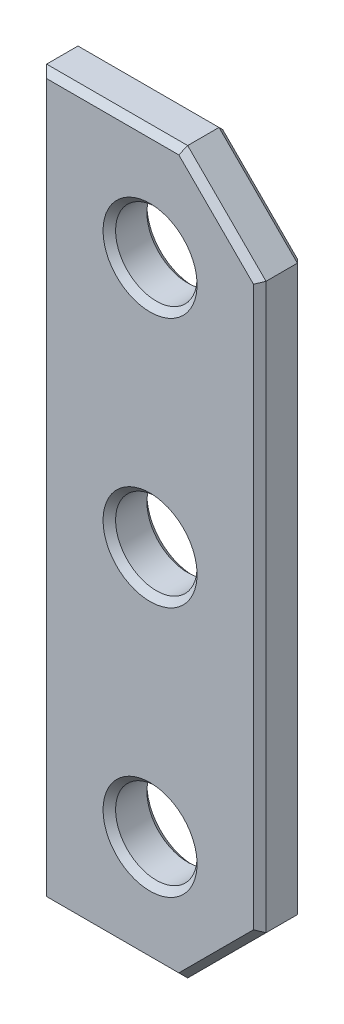
ISO-10303-21;
HEADER;
FILE_DESCRIPTION(('STEP AP214'),'2;1');
FILE_NAME('part.step','',(''),(''),'','','');
FILE_SCHEMA(('AUTOMOTIVE_DESIGN { 1 0 10303 214 1 1 1 1 }'));
ENDSEC;
DATA;
#1=APPLICATION_CONTEXT('core data for automotive mechanical design processes');
#2=APPLICATION_PROTOCOL_DEFINITION('international standard','automotive_design',2000,#1);
#3=PRODUCT_CONTEXT('',#1,'mechanical');
#4=PRODUCT('Part','Part','',(#3));
#5=PRODUCT_RELATED_PRODUCT_CATEGORY('part','',(#4));
#6=PRODUCT_DEFINITION_FORMATION('','',#4);
#7=PRODUCT_DEFINITION_CONTEXT('part definition',#1,'design');
#8=PRODUCT_DEFINITION('design','',#6,#7);
#9=PRODUCT_DEFINITION_SHAPE('','',#8);
#10=(LENGTH_UNIT() NAMED_UNIT(*) SI_UNIT(.MILLI.,.METRE.));
#11=(NAMED_UNIT(*) PLANE_ANGLE_UNIT() SI_UNIT($,.RADIAN.));
#12=(NAMED_UNIT(*) SI_UNIT($,.STERADIAN.) SOLID_ANGLE_UNIT());
#13=UNCERTAINTY_MEASURE_WITH_UNIT(LENGTH_MEASURE(1.E-05),#10,'distance_accuracy_value','');
#14=(GEOMETRIC_REPRESENTATION_CONTEXT(3) GLOBAL_UNCERTAINTY_ASSIGNED_CONTEXT((#13)) GLOBAL_UNIT_ASSIGNED_CONTEXT((#10,
#11,#12)) REPRESENTATION_CONTEXT('',''));
#15=CARTESIAN_POINT('',(0.,0.,0.));
#16=DIRECTION('',(0.,0.,1.));
#17=DIRECTION('',(1.,0.,0.));
#18=AXIS2_PLACEMENT_3D('',#15,#16,#17);
#19=CARTESIAN_POINT('',(0.,230.,14.));
#20=DIRECTION('',(0.,0.,-1.));
#21=DIRECTION('',(-1.,0.,0.));
#22=AXIS2_PLACEMENT_3D('',#19,#20,#21);
#23=PLANE('',#22);
#24=CARTESIAN_POINT('',(35.,195.,14.));
#25=DIRECTION('',(0.,0.,-1.));
#26=DIRECTION('',(-1.,0.,0.));
#27=AXIS2_PLACEMENT_3D('',#24,#25,#26);
#28=CIRCLE('',#27,15.);
#29=CARTESIAN_POINT('',(20.,195.,14.));
#30=VERTEX_POINT('',#29);
#31=EDGE_CURVE('E11',#30,#30,#28,.T.);
#32=ORIENTED_EDGE('',*,*,#31,.T.);
#33=EDGE_LOOP('',(#32));
#34=FACE_BOUND('',#33,.T.);
#35=CARTESIAN_POINT('',(35.,35.,14.));
#36=DIRECTION('',(0.,0.,-1.));
#37=DIRECTION('',(-1.,0.,0.));
#38=AXIS2_PLACEMENT_3D('',#35,#36,#37);
#39=CIRCLE('',#38,15.);
#40=CARTESIAN_POINT('',(20.,35.,14.));
#41=VERTEX_POINT('',#40);
#42=EDGE_CURVE('E45',#41,#41,#39,.T.);
#43=ORIENTED_EDGE('',*,*,#42,.T.);
#44=EDGE_LOOP('',(#43));
#45=FACE_BOUND('',#44,.T.);
#46=DIRECTION('',(-0.707106781186543,0.707106781186552,0.));
#47=VECTOR('',#46,1.);
#48=CARTESIAN_POINT('',(21.0857864376272,251.085786437627,14.));
#49=LINE('',#48,#47);
#50=CARTESIAN_POINT('',(68.,204.171572875254,14.));
#51=VERTEX_POINT('',#50);
#52=CARTESIAN_POINT('',(44.1715728752538,228.,14.));
#53=VERTEX_POINT('',#52);
#54=EDGE_CURVE('E53',#51,#53,#49,.T.);
#55=ORIENTED_EDGE('',*,*,#54,.T.);
#56=DIRECTION('',(-1.,0.,0.));
#57=VECTOR('',#56,1.);
#58=CARTESIAN_POINT('',(0.,228.,14.));
#59=LINE('',#58,#57);
#60=CARTESIAN_POINT('',(2.,228.,14.));
#61=VERTEX_POINT('',#60);
#62=EDGE_CURVE('E219',#53,#61,#59,.T.);
#63=ORIENTED_EDGE('',*,*,#62,.T.);
#64=DIRECTION('',(0.,-1.,0.));
#65=VECTOR('',#64,1.);
#66=CARTESIAN_POINT('',(2.,230.,14.));
#67=LINE('',#66,#65);
#68=CARTESIAN_POINT('',(2.,2.,14.));
#69=VERTEX_POINT('',#68);
#70=EDGE_CURVE('E211',#61,#69,#67,.T.);
#71=ORIENTED_EDGE('',*,*,#70,.T.);
#72=DIRECTION('',(1.,0.,0.));
#73=VECTOR('',#72,1.);
#74=CARTESIAN_POINT('',(0.,2.,14.));
#75=LINE('',#74,#73);
#76=CARTESIAN_POINT('',(44.1715728752538,2.,14.));
#77=VERTEX_POINT('',#76);
#78=EDGE_CURVE('E213',#69,#77,#75,.T.);
#79=ORIENTED_EDGE('',*,*,#78,.T.);
#80=DIRECTION('',(0.707106781186543,0.707106781186552,0.));
#81=VECTOR('',#80,1.);
#82=CARTESIAN_POINT('',(136.085786437627,93.9142135623746,14.));
#83=LINE('',#82,#81);
#84=CARTESIAN_POINT('',(68.,25.8284271247465,14.));
#85=VERTEX_POINT('',#84);
#86=EDGE_CURVE('E215',#77,#85,#83,.T.);
#87=ORIENTED_EDGE('',*,*,#86,.T.);
#88=DIRECTION('',(0.,1.,0.));
#89=VECTOR('',#88,1.);
#90=CARTESIAN_POINT('',(68.,230.,14.));
#91=LINE('',#90,#89);
#92=EDGE_CURVE('E58',#85,#51,#91,.T.);
#93=ORIENTED_EDGE('',*,*,#92,.T.);
#94=EDGE_LOOP('',(#55,#63,#71,#79,#87,#93));
#95=FACE_BOUND('',#94,.T.);
#96=CARTESIAN_POINT('',(35.,115.,14.));
#97=DIRECTION('',(0.,0.,-1.));
#98=DIRECTION('',(-1.,0.,0.));
#99=AXIS2_PLACEMENT_3D('',#96,#97,#98);
#100=CIRCLE('',#99,15.);
#101=CARTESIAN_POINT('',(20.,115.,14.));
#102=VERTEX_POINT('',#101);
#103=EDGE_CURVE('E208',#102,#102,#100,.T.);
#104=ORIENTED_EDGE('',*,*,#103,.T.);
#105=EDGE_LOOP('',(#104));
#106=FACE_BOUND('',#105,.T.);
#107=ADVANCED_FACE('F36',(#34,#45,#95,#106),#23,.F.);
#108=CARTESIAN_POINT('',(0.,230.,0.));
#109=DIRECTION('',(0.,0.,-1.));
#110=DIRECTION('',(-1.,0.,0.));
#111=AXIS2_PLACEMENT_3D('',#108,#109,#110);
#112=PLANE('',#111);
#113=CARTESIAN_POINT('',(35.,195.,0.));
#114=DIRECTION('',(0.,0.,-1.));
#115=DIRECTION('',(-1.,0.,0.));
#116=AXIS2_PLACEMENT_3D('',#113,#114,#115);
#117=CIRCLE('',#116,15.);
#118=CARTESIAN_POINT('',(20.,195.,0.));
#119=VERTEX_POINT('',#118);
#120=EDGE_CURVE('E158',#119,#119,#117,.F.);
#121=ORIENTED_EDGE('',*,*,#120,.T.);
#122=EDGE_LOOP('',(#121));
#123=FACE_BOUND('',#122,.T.);
#124=CARTESIAN_POINT('',(35.,35.,0.));
#125=DIRECTION('',(0.,0.,-1.));
#126=DIRECTION('',(-1.,0.,0.));
#127=AXIS2_PLACEMENT_3D('',#124,#125,#126);
#128=CIRCLE('',#127,15.);
#129=CARTESIAN_POINT('',(20.,35.,0.));
#130=VERTEX_POINT('',#129);
#131=EDGE_CURVE('E155',#130,#130,#128,.F.);
#132=ORIENTED_EDGE('',*,*,#131,.T.);
#133=EDGE_LOOP('',(#132));
#134=FACE_BOUND('',#133,.T.);
#135=DIRECTION('',(-0.707106781186543,-0.707106781186552,0.));
#136=VECTOR('',#135,1.);
#137=CARTESIAN_POINT('',(43.5857864376269,1.4142135623731,0.));
#138=LINE('',#137,#136);
#139=CARTESIAN_POINT('',(68.,25.8284271247465,0.));
#140=VERTEX_POINT('',#139);
#141=CARTESIAN_POINT('',(44.1715728752538,2.,0.));
#142=VERTEX_POINT('',#141);
#143=EDGE_CURVE('E154',#140,#142,#138,.T.);
#144=ORIENTED_EDGE('',*,*,#143,.T.);
#145=DIRECTION('',(-1.,0.,0.));
#146=VECTOR('',#145,1.);
#147=CARTESIAN_POINT('',(0.,2.,0.));
#148=LINE('',#147,#146);
#149=CARTESIAN_POINT('',(2.00000000000001,2.,0.));
#150=VERTEX_POINT('',#149);
#151=EDGE_CURVE('E132',#142,#150,#148,.T.);
#152=ORIENTED_EDGE('',*,*,#151,.T.);
#153=DIRECTION('',(0.,1.,0.));
#154=VECTOR('',#153,1.);
#155=CARTESIAN_POINT('',(2.00000000000001,230.,0.));
#156=LINE('',#155,#154);
#157=CARTESIAN_POINT('',(2.00000000000001,228.,0.));
#158=VERTEX_POINT('',#157);
#159=EDGE_CURVE('E142',#150,#158,#156,.T.);
#160=ORIENTED_EDGE('',*,*,#159,.T.);
#161=DIRECTION('',(1.,0.,0.));
#162=VECTOR('',#161,1.);
#163=CARTESIAN_POINT('',(45.,228.,0.));
#164=LINE('',#163,#162);
#165=CARTESIAN_POINT('',(44.1715728752538,228.,0.));
#166=VERTEX_POINT('',#165);
#167=EDGE_CURVE('E148',#158,#166,#164,.T.);
#168=ORIENTED_EDGE('',*,*,#167,.T.);
#169=DIRECTION('',(0.707106781186543,-0.707106781186552,0.));
#170=VECTOR('',#169,1.);
#171=CARTESIAN_POINT('',(68.5857864376269,203.585786437627,0.));
#172=LINE('',#171,#170);
#173=CARTESIAN_POINT('',(68.,204.171572875254,0.));
#174=VERTEX_POINT('',#173);
#175=EDGE_CURVE('E280',#166,#174,#172,.T.);
#176=ORIENTED_EDGE('',*,*,#175,.T.);
#177=DIRECTION('',(0.,-1.,0.));
#178=VECTOR('',#177,1.);
#179=CARTESIAN_POINT('',(68.,25.0000000000003,0.));
#180=LINE('',#179,#178);
#181=EDGE_CURVE('E160',#174,#140,#180,.T.);
#182=ORIENTED_EDGE('',*,*,#181,.T.);
#183=EDGE_LOOP('',(#144,#152,#160,#168,#176,#182));
#184=FACE_BOUND('',#183,.T.);
#185=CARTESIAN_POINT('',(35.,115.,0.));
#186=DIRECTION('',(0.,0.,-1.));
#187=DIRECTION('',(-1.,0.,0.));
#188=AXIS2_PLACEMENT_3D('',#185,#186,#187);
#189=CIRCLE('',#188,15.);
#190=CARTESIAN_POINT('',(20.,115.,0.));
#191=VERTEX_POINT('',#190);
#192=EDGE_CURVE('E149',#191,#191,#189,.F.);
#193=ORIENTED_EDGE('',*,*,#192,.T.);
#194=EDGE_LOOP('',(#193));
#195=FACE_BOUND('',#194,.T.);
#196=ADVANCED_FACE('F151',(#123,#134,#184,#195),#112,.T.);
#197=CARTESIAN_POINT('',(0.,0.,14.));
#198=DIRECTION('',(1.,0.,0.));
#199=DIRECTION('',(0.,0.,-1.));
#200=AXIS2_PLACEMENT_3D('',#197,#198,#199);
#201=PLANE('',#200);
#202=DIRECTION('',(0.,0.,-1.));
#203=VECTOR('',#202,1.);
#204=CARTESIAN_POINT('',(0.,230.,14.));
#205=LINE('',#204,#203);
#206=CARTESIAN_POINT('',(0.,230.,12.));
#207=VERTEX_POINT('',#206);
#208=CARTESIAN_POINT('',(0.,230.,2.));
#209=VERTEX_POINT('',#208);
#210=EDGE_CURVE('E233',#207,#209,#205,.T.);
#211=ORIENTED_EDGE('',*,*,#210,.T.);
#212=DIRECTION('',(0.,-1.,0.));
#213=VECTOR('',#212,1.);
#214=CARTESIAN_POINT('',(0.,0.,2.));
#215=LINE('',#214,#213);
#216=CARTESIAN_POINT('',(0.,0.,2.));
#217=VERTEX_POINT('',#216);
#218=EDGE_CURVE('E200',#209,#217,#215,.T.);
#219=ORIENTED_EDGE('',*,*,#218,.T.);
#220=DIRECTION('',(0.,0.,-1.));
#221=VECTOR('',#220,1.);
#222=CARTESIAN_POINT('',(0.,0.,14.));
#223=LINE('',#222,#221);
#224=CARTESIAN_POINT('',(0.,0.,12.));
#225=VERTEX_POINT('',#224);
#226=EDGE_CURVE('E270',#225,#217,#223,.T.);
#227=ORIENTED_EDGE('',*,*,#226,.F.);
#228=DIRECTION('',(0.,1.,0.));
#229=VECTOR('',#228,1.);
#230=CARTESIAN_POINT('',(0.,0.,12.));
#231=LINE('',#230,#229);
#232=EDGE_CURVE('E198',#225,#207,#231,.T.);
#233=ORIENTED_EDGE('',*,*,#232,.T.);
#234=EDGE_LOOP('',(#211,#219,#227,#233));
#235=FACE_BOUND('',#234,.T.);
#236=ADVANCED_FACE('F304',(#235),#201,.F.);
#237=CARTESIAN_POINT('',(0.,0.,14.));
#238=DIRECTION('',(0.,1.,0.));
#239=DIRECTION('',(0.,0.,1.));
#240=AXIS2_PLACEMENT_3D('',#237,#238,#239);
#241=PLANE('',#240);
#242=ORIENTED_EDGE('',*,*,#226,.T.);
#243=DIRECTION('',(1.,0.,0.));
#244=VECTOR('',#243,1.);
#245=CARTESIAN_POINT('',(45.,0.,2.));
#246=LINE('',#245,#244);
#247=CARTESIAN_POINT('',(45.,0.,2.));
#248=VERTEX_POINT('',#247);
#249=EDGE_CURVE('E135',#217,#248,#246,.T.);
#250=ORIENTED_EDGE('',*,*,#249,.T.);
#251=DIRECTION('',(0.,0.,-1.));
#252=VECTOR('',#251,1.);
#253=CARTESIAN_POINT('',(45.,0.,14.));
#254=LINE('',#253,#252);
#255=CARTESIAN_POINT('',(45.,0.,12.));
#256=VERTEX_POINT('',#255);
#257=EDGE_CURVE('E263',#256,#248,#254,.T.);
#258=ORIENTED_EDGE('',*,*,#257,.F.);
#259=DIRECTION('',(-1.,0.,0.));
#260=VECTOR('',#259,1.);
#261=CARTESIAN_POINT('',(0.,0.,12.));
#262=LINE('',#261,#260);
#263=EDGE_CURVE('E178',#256,#225,#262,.T.);
#264=ORIENTED_EDGE('',*,*,#263,.T.);
#265=EDGE_LOOP('',(#242,#250,#258,#264));
#266=FACE_BOUND('',#265,.T.);
#267=ADVANCED_FACE('F268',(#266),#241,.F.);
#268=CARTESIAN_POINT('',(45.,0.,14.));
#269=DIRECTION('',(-0.707106781186552,0.707106781186543,0.));
#270=DIRECTION('',(-0.707106781186543,-0.707106781186552,0.));
#271=AXIS2_PLACEMENT_3D('',#268,#269,#270);
#272=PLANE('',#271);
#273=ORIENTED_EDGE('',*,*,#257,.T.);
#274=DIRECTION('',(0.707106781186543,0.707106781186552,0.));
#275=VECTOR('',#274,1.);
#276=CARTESIAN_POINT('',(70.,25.0000000000003,2.));
#277=LINE('',#276,#275);
#278=CARTESIAN_POINT('',(70.,25.0000000000003,2.));
#279=VERTEX_POINT('',#278);
#280=EDGE_CURVE('E183',#248,#279,#277,.T.);
#281=ORIENTED_EDGE('',*,*,#280,.T.);
#282=DIRECTION('',(0.,0.,-1.));
#283=VECTOR('',#282,1.);
#284=CARTESIAN_POINT('',(70.,25.0000000000003,14.));
#285=LINE('',#284,#283);
#286=CARTESIAN_POINT('',(70.,25.0000000000003,12.));
#287=VERTEX_POINT('',#286);
#288=EDGE_CURVE('E265',#287,#279,#285,.T.);
#289=ORIENTED_EDGE('',*,*,#288,.F.);
#290=DIRECTION('',(-0.707106781186543,-0.707106781186552,0.));
#291=VECTOR('',#290,1.);
#292=CARTESIAN_POINT('',(45.,0.,12.));
#293=LINE('',#292,#291);
#294=EDGE_CURVE('E181',#287,#256,#293,.T.);
#295=ORIENTED_EDGE('',*,*,#294,.T.);
#296=EDGE_LOOP('',(#273,#281,#289,#295));
#297=FACE_BOUND('',#296,.T.);
#298=ADVANCED_FACE('F262',(#297),#272,.F.);
#299=CARTESIAN_POINT('',(70.,25.0000000000003,14.));
#300=DIRECTION('',(-1.,0.,0.));
#301=DIRECTION('',(0.,-1.,0.));
#302=AXIS2_PLACEMENT_3D('',#299,#300,#301);
#303=PLANE('',#302);
#304=ORIENTED_EDGE('',*,*,#288,.T.);
#305=DIRECTION('',(0.,1.,0.));
#306=VECTOR('',#305,1.);
#307=CARTESIAN_POINT('',(70.,205.,2.));
#308=LINE('',#307,#306);
#309=CARTESIAN_POINT('',(70.,205.,2.));
#310=VERTEX_POINT('',#309);
#311=EDGE_CURVE('E187',#279,#310,#308,.T.);
#312=ORIENTED_EDGE('',*,*,#311,.T.);
#313=DIRECTION('',(0.,0.,-1.));
#314=VECTOR('',#313,1.);
#315=CARTESIAN_POINT('',(70.,205.,14.));
#316=LINE('',#315,#314);
#317=CARTESIAN_POINT('',(70.,205.,12.));
#318=VERTEX_POINT('',#317);
#319=EDGE_CURVE('E273',#318,#310,#316,.T.);
#320=ORIENTED_EDGE('',*,*,#319,.F.);
#321=DIRECTION('',(0.,-1.,0.));
#322=VECTOR('',#321,1.);
#323=CARTESIAN_POINT('',(70.,25.0000000000003,12.));
#324=LINE('',#323,#322);
#325=EDGE_CURVE('E185',#318,#287,#324,.T.);
#326=ORIENTED_EDGE('',*,*,#325,.T.);
#327=EDGE_LOOP('',(#304,#312,#320,#326));
#328=FACE_BOUND('',#327,.T.);
#329=ADVANCED_FACE('F292',(#328),#303,.F.);
#330=CARTESIAN_POINT('',(45.,230.,14.));
#331=DIRECTION('',(-0.707106781186552,-0.707106781186543,0.));
#332=DIRECTION('',(0.707106781186543,-0.707106781186552,0.));
#333=AXIS2_PLACEMENT_3D('',#330,#331,#332);
#334=PLANE('',#333);
#335=ORIENTED_EDGE('',*,*,#319,.T.);
#336=DIRECTION('',(-0.707106781186543,0.707106781186552,0.));
#337=VECTOR('',#336,1.);
#338=CARTESIAN_POINT('',(45.,230.,2.));
#339=LINE('',#338,#337);
#340=CARTESIAN_POINT('',(45.,230.,2.));
#341=VERTEX_POINT('',#340);
#342=EDGE_CURVE('E191',#310,#341,#339,.T.);
#343=ORIENTED_EDGE('',*,*,#342,.T.);
#344=DIRECTION('',(0.,0.,-1.));
#345=VECTOR('',#344,1.);
#346=CARTESIAN_POINT('',(45.,230.,14.));
#347=LINE('',#346,#345);
#348=CARTESIAN_POINT('',(45.,230.,12.));
#349=VERTEX_POINT('',#348);
#350=EDGE_CURVE('E297',#349,#341,#347,.T.);
#351=ORIENTED_EDGE('',*,*,#350,.F.);
#352=DIRECTION('',(0.707106781186543,-0.707106781186552,0.));
#353=VECTOR('',#352,1.);
#354=CARTESIAN_POINT('',(45.,230.,12.));
#355=LINE('',#354,#353);
#356=EDGE_CURVE('E189',#349,#318,#355,.T.);
#357=ORIENTED_EDGE('',*,*,#356,.T.);
#358=EDGE_LOOP('',(#335,#343,#351,#357));
#359=FACE_BOUND('',#358,.T.);
#360=ADVANCED_FACE('F315',(#359),#334,.F.);
#361=CARTESIAN_POINT('',(0.,230.,14.));
#362=DIRECTION('',(0.,-1.,0.));
#363=DIRECTION('',(0.,0.,-1.));
#364=AXIS2_PLACEMENT_3D('',#361,#362,#363);
#365=PLANE('',#364);
#366=ORIENTED_EDGE('',*,*,#350,.T.);
#367=DIRECTION('',(-1.,0.,0.));
#368=VECTOR('',#367,1.);
#369=CARTESIAN_POINT('',(0.,230.,2.));
#370=LINE('',#369,#368);
#371=EDGE_CURVE('E196',#341,#209,#370,.T.);
#372=ORIENTED_EDGE('',*,*,#371,.T.);
#373=ORIENTED_EDGE('',*,*,#210,.F.);
#374=DIRECTION('',(1.,0.,0.));
#375=VECTOR('',#374,1.);
#376=CARTESIAN_POINT('',(0.,230.,12.));
#377=LINE('',#376,#375);
#378=EDGE_CURVE('E193',#207,#349,#377,.T.);
#379=ORIENTED_EDGE('',*,*,#378,.T.);
#380=EDGE_LOOP('',(#366,#372,#373,#379));
#381=FACE_BOUND('',#380,.T.);
#382=ADVANCED_FACE('F316',(#381),#365,.F.);
#383=CARTESIAN_POINT('',(35.,35.,14.));
#384=DIRECTION('',(0.,0.,-1.));
#385=DIRECTION('',(-1.,0.,0.));
#386=AXIS2_PLACEMENT_3D('',#383,#384,#385);
#387=CYLINDRICAL_SURFACE('',#386,13.);
#388=CARTESIAN_POINT('',(35.,35.,2.00000000000001));
#389=DIRECTION('',(0.,0.,-1.));
#390=DIRECTION('',(-1.,0.,0.));
#391=AXIS2_PLACEMENT_3D('',#388,#389,#390);
#392=CIRCLE('',#391,13.);
#393=CARTESIAN_POINT('',(22.,35.,2.00000000000001));
#394=VERTEX_POINT('',#393);
#395=EDGE_CURVE('E175',#394,#394,#392,.T.);
#396=ORIENTED_EDGE('',*,*,#395,.T.);
#397=EDGE_LOOP('',(#396));
#398=FACE_BOUND('',#397,.T.);
#399=CARTESIAN_POINT('',(35.,35.,12.));
#400=DIRECTION('',(0.,0.,-1.));
#401=DIRECTION('',(-1.,0.,0.));
#402=AXIS2_PLACEMENT_3D('',#399,#400,#401);
#403=CIRCLE('',#402,13.);
#404=CARTESIAN_POINT('',(22.,35.,12.));
#405=VERTEX_POINT('',#404);
#406=EDGE_CURVE('E172',#405,#405,#403,.F.);
#407=ORIENTED_EDGE('',*,*,#406,.T.);
#408=EDGE_LOOP('',(#407));
#409=FACE_BOUND('',#408,.T.);
#410=ADVANCED_FACE('F339',(#398,#409),#387,.F.);
#411=CARTESIAN_POINT('',(35.,115.,14.));
#412=DIRECTION('',(0.,0.,-1.));
#413=DIRECTION('',(-1.,0.,0.));
#414=AXIS2_PLACEMENT_3D('',#411,#412,#413);
#415=CYLINDRICAL_SURFACE('',#414,13.);
#416=CARTESIAN_POINT('',(35.,115.,2.00000000000001));
#417=DIRECTION('',(0.,0.,-1.));
#418=DIRECTION('',(-1.,0.,0.));
#419=AXIS2_PLACEMENT_3D('',#416,#417,#418);
#420=CIRCLE('',#419,13.);
#421=CARTESIAN_POINT('',(22.,115.,2.00000000000001));
#422=VERTEX_POINT('',#421);
#423=EDGE_CURVE('E205',#422,#422,#420,.T.);
#424=ORIENTED_EDGE('',*,*,#423,.T.);
#425=EDGE_LOOP('',(#424));
#426=FACE_BOUND('',#425,.T.);
#427=CARTESIAN_POINT('',(35.,115.,12.));
#428=DIRECTION('',(0.,0.,-1.));
#429=DIRECTION('',(-1.,0.,0.));
#430=AXIS2_PLACEMENT_3D('',#427,#428,#429);
#431=CIRCLE('',#430,13.);
#432=CARTESIAN_POINT('',(22.,115.,12.));
#433=VERTEX_POINT('',#432);
#434=EDGE_CURVE('E202',#433,#433,#431,.F.);
#435=ORIENTED_EDGE('',*,*,#434,.T.);
#436=EDGE_LOOP('',(#435));
#437=FACE_BOUND('',#436,.T.);
#438=ADVANCED_FACE('F336',(#426,#437),#415,.F.);
#439=CARTESIAN_POINT('',(35.,195.,14.));
#440=DIRECTION('',(0.,0.,-1.));
#441=DIRECTION('',(-1.,0.,0.));
#442=AXIS2_PLACEMENT_3D('',#439,#440,#441);
#443=CYLINDRICAL_SURFACE('',#442,13.);
#444=CARTESIAN_POINT('',(35.,195.,2.00000000000001));
#445=DIRECTION('',(0.,0.,-1.));
#446=DIRECTION('',(-1.,0.,0.));
#447=AXIS2_PLACEMENT_3D('',#444,#445,#446);
#448=CIRCLE('',#447,13.);
#449=CARTESIAN_POINT('',(22.,195.,2.00000000000001));
#450=VERTEX_POINT('',#449);
#451=EDGE_CURVE('E169',#450,#450,#448,.T.);
#452=ORIENTED_EDGE('',*,*,#451,.T.);
#453=EDGE_LOOP('',(#452));
#454=FACE_BOUND('',#453,.T.);
#455=CARTESIAN_POINT('',(35.,195.,12.));
#456=DIRECTION('',(0.,0.,-1.));
#457=DIRECTION('',(-1.,0.,0.));
#458=AXIS2_PLACEMENT_3D('',#455,#456,#457);
#459=CIRCLE('',#458,13.);
#460=CARTESIAN_POINT('',(22.,195.,12.));
#461=VERTEX_POINT('',#460);
#462=EDGE_CURVE('E166',#461,#461,#459,.F.);
#463=ORIENTED_EDGE('',*,*,#462,.T.);
#464=EDGE_LOOP('',(#463));
#465=FACE_BOUND('',#464,.T.);
#466=ADVANCED_FACE('F338',(#454,#465),#443,.F.);
#467=CARTESIAN_POINT('',(35.,195.,0.));
#468=DIRECTION('',(0.,0.,-1.));
#469=DIRECTION('',(-1.,0.,0.));
#470=AXIS2_PLACEMENT_3D('',#467,#468,#469);
#471=CONICAL_SURFACE('',#470,15.,0.785398163397447);
#472=ORIENTED_EDGE('',*,*,#451,.F.);
#473=EDGE_LOOP('',(#472));
#474=FACE_BOUND('',#473,.T.);
#475=ORIENTED_EDGE('',*,*,#120,.F.);
#476=EDGE_LOOP('',(#475));
#477=FACE_BOUND('',#476,.T.);
#478=ADVANCED_FACE('F346',(#474,#477),#471,.F.);
#479=CARTESIAN_POINT('',(35.,35.,0.));
#480=DIRECTION('',(0.,0.,-1.));
#481=DIRECTION('',(-1.,0.,0.));
#482=AXIS2_PLACEMENT_3D('',#479,#480,#481);
#483=CONICAL_SURFACE('',#482,15.,0.785398163397445);
#484=ORIENTED_EDGE('',*,*,#395,.F.);
#485=EDGE_LOOP('',(#484));
#486=FACE_BOUND('',#485,.T.);
#487=ORIENTED_EDGE('',*,*,#131,.F.);
#488=EDGE_LOOP('',(#487));
#489=FACE_BOUND('',#488,.T.);
#490=ADVANCED_FACE('F369',(#486,#489),#483,.F.);
#491=CARTESIAN_POINT('',(45.,230.,2.));
#492=DIRECTION('',(0.500000000000001,0.499999999999995,-0.70710678118655));
#493=DIRECTION('',(-0.816496580927726,0.,-0.577350269189625));
#494=AXIS2_PLACEMENT_3D('',#491,#492,#493);
#495=PLANE('',#494);
#496=DIRECTION('',(-0.678598344545848,-0.281084637714822,-0.678598344545846));
#497=VECTOR('',#496,1.);
#498=CARTESIAN_POINT('',(63.2561964152546,202.206625093218,-4.74380358474536));
#499=LINE('',#498,#497);
#500=EDGE_CURVE('E227',#174,#310,#499,.F.);
#501=ORIENTED_EDGE('',*,*,#500,.F.);
#502=ORIENTED_EDGE('',*,*,#175,.F.);
#503=DIRECTION('',(-0.281084637714828,-0.678598344545846,-0.678598344545845));
#504=VECTOR('',#503,1.);
#505=CARTESIAN_POINT('',(41.4446141898326,221.416539357625,-6.58346064237479));
#506=LINE('',#505,#504);
#507=EDGE_CURVE('E230',#341,#166,#506,.T.);
#508=ORIENTED_EDGE('',*,*,#507,.F.);
#509=ORIENTED_EDGE('',*,*,#342,.F.);
#510=EDGE_LOOP('',(#501,#502,#508,#509));
#511=FACE_BOUND('',#510,.T.);
#512=ADVANCED_FACE('F313',(#511),#495,.T.);
#513=CARTESIAN_POINT('',(0.,230.,2.));
#514=DIRECTION('',(0.,0.707106781186547,-0.707106781186548));
#515=DIRECTION('',(0.,0.707106781186548,0.707106781186547));
#516=AXIS2_PLACEMENT_3D('',#513,#514,#515);
#517=PLANE('',#516);
#518=ORIENTED_EDGE('',*,*,#507,.T.);
#519=ORIENTED_EDGE('',*,*,#167,.F.);
#520=DIRECTION('',(0.577350269189627,-0.577350269189625,-0.577350269189625));
#521=VECTOR('',#520,1.);
#522=CARTESIAN_POINT('',(76.6666666666668,153.333333333333,-74.6666666666665));
#523=LINE('',#522,#521);
#524=EDGE_CURVE('E145',#209,#158,#523,.T.);
#525=ORIENTED_EDGE('',*,*,#524,.F.);
#526=ORIENTED_EDGE('',*,*,#371,.F.);
#527=EDGE_LOOP('',(#518,#519,#525,#526));
#528=FACE_BOUND('',#527,.T.);
#529=ADVANCED_FACE('F310',(#528),#517,.T.);
#530=CARTESIAN_POINT('',(70.,25.0000000000003,2.));
#531=DIRECTION('',(0.707106781186547,0.,-0.707106781186549));
#532=DIRECTION('',(-0.707106781186549,0.,-0.707106781186547));
#533=AXIS2_PLACEMENT_3D('',#530,#531,#532);
#534=PLANE('',#533);
#535=ORIENTED_EDGE('',*,*,#500,.T.);
#536=ORIENTED_EDGE('',*,*,#311,.F.);
#537=DIRECTION('',(-0.678598344545847,0.281084637714823,-0.678598344545846));
#538=VECTOR('',#537,1.);
#539=CARTESIAN_POINT('',(70.,25.0000000000003,2.));
#540=LINE('',#539,#538);
#541=EDGE_CURVE('E138',#140,#279,#540,.F.);
#542=ORIENTED_EDGE('',*,*,#541,.F.);
#543=ORIENTED_EDGE('',*,*,#181,.F.);
#544=EDGE_LOOP('',(#535,#536,#542,#543));
#545=FACE_BOUND('',#544,.T.);
#546=ADVANCED_FACE('F287',(#545),#534,.T.);
#547=CARTESIAN_POINT('',(0.,0.,2.));
#548=DIRECTION('',(-0.707106781186546,0.,-0.707106781186549));
#549=DIRECTION('',(-0.707106781186549,0.,0.707106781186546));
#550=AXIS2_PLACEMENT_3D('',#547,#548,#549);
#551=PLANE('',#550);
#552=ORIENTED_EDGE('',*,*,#524,.T.);
#553=ORIENTED_EDGE('',*,*,#159,.F.);
#554=DIRECTION('',(-0.577350269189627,-0.577350269189625,0.577350269189625));
#555=VECTOR('',#554,1.);
#556=CARTESIAN_POINT('',(0.,0.,2.));
#557=LINE('',#556,#555);
#558=EDGE_CURVE('E128',#217,#150,#557,.F.);
#559=ORIENTED_EDGE('',*,*,#558,.F.);
#560=ORIENTED_EDGE('',*,*,#218,.F.);
#561=EDGE_LOOP('',(#552,#553,#559,#560));
#562=FACE_BOUND('',#561,.T.);
#563=ADVANCED_FACE('F143',(#562),#551,.T.);
#564=CARTESIAN_POINT('',(45.,0.,2.));
#565=DIRECTION('',(0.500000000000001,-0.499999999999995,-0.70710678118655));
#566=DIRECTION('',(-0.816496580927726,0.,-0.577350269189625));
#567=AXIS2_PLACEMENT_3D('',#564,#565,#566);
#568=PLANE('',#567);
#569=ORIENTED_EDGE('',*,*,#541,.T.);
#570=ORIENTED_EDGE('',*,*,#280,.F.);
#571=DIRECTION('',(-0.281084637714829,0.678598344545846,-0.678598344545845));
#572=VECTOR('',#571,1.);
#573=CARTESIAN_POINT('',(45.,0.,2.));
#574=LINE('',#573,#572);
#575=EDGE_CURVE('E139',#142,#248,#574,.F.);
#576=ORIENTED_EDGE('',*,*,#575,.F.);
#577=ORIENTED_EDGE('',*,*,#143,.F.);
#578=EDGE_LOOP('',(#569,#570,#576,#577));
#579=FACE_BOUND('',#578,.T.);
#580=ADVANCED_FACE('F290',(#579),#568,.T.);
#581=CARTESIAN_POINT('',(0.,0.,2.));
#582=DIRECTION('',(0.,-0.707106781186547,-0.707106781186548));
#583=DIRECTION('',(0.,0.707106781186548,-0.707106781186547));
#584=AXIS2_PLACEMENT_3D('',#581,#582,#583);
#585=PLANE('',#584);
#586=ORIENTED_EDGE('',*,*,#558,.T.);
#587=ORIENTED_EDGE('',*,*,#151,.F.);
#588=ORIENTED_EDGE('',*,*,#575,.T.);
#589=ORIENTED_EDGE('',*,*,#249,.F.);
#590=EDGE_LOOP('',(#586,#587,#588,#589));
#591=FACE_BOUND('',#590,.T.);
#592=ADVANCED_FACE('F130',(#591),#585,.T.);
#593=CARTESIAN_POINT('',(35.,115.,0.));
#594=DIRECTION('',(0.,0.,-1.));
#595=DIRECTION('',(-1.,0.,0.));
#596=AXIS2_PLACEMENT_3D('',#593,#594,#595);
#597=CONICAL_SURFACE('',#596,15.,0.785398163397446);
#598=ORIENTED_EDGE('',*,*,#423,.F.);
#599=EDGE_LOOP('',(#598));
#600=FACE_BOUND('',#599,.T.);
#601=ORIENTED_EDGE('',*,*,#192,.F.);
#602=EDGE_LOOP('',(#601));
#603=FACE_BOUND('',#602,.T.);
#604=ADVANCED_FACE('F376',(#600,#603),#597,.F.);
#605=CARTESIAN_POINT('',(35.,195.,12.));
#606=DIRECTION('',(0.,0.,1.));
#607=DIRECTION('',(1.,0.,0.));
#608=AXIS2_PLACEMENT_3D('',#605,#606,#607);
#609=CONICAL_SURFACE('',#608,13.,0.78539816339745);
#610=ORIENTED_EDGE('',*,*,#31,.F.);
#611=EDGE_LOOP('',(#610));
#612=FACE_BOUND('',#611,.T.);
#613=ORIENTED_EDGE('',*,*,#462,.F.);
#614=EDGE_LOOP('',(#613));
#615=FACE_BOUND('',#614,.T.);
#616=ADVANCED_FACE('F389',(#612,#615),#609,.F.);
#617=CARTESIAN_POINT('',(35.,35.,12.));
#618=DIRECTION('',(0.,0.,1.));
#619=DIRECTION('',(1.,0.,0.));
#620=AXIS2_PLACEMENT_3D('',#617,#618,#619);
#621=CONICAL_SURFACE('',#620,13.,0.785398163397451);
#622=ORIENTED_EDGE('',*,*,#42,.F.);
#623=EDGE_LOOP('',(#622));
#624=FACE_BOUND('',#623,.T.);
#625=ORIENTED_EDGE('',*,*,#406,.F.);
#626=EDGE_LOOP('',(#625));
#627=FACE_BOUND('',#626,.T.);
#628=ADVANCED_FACE('F393',(#624,#627),#621,.F.);
#629=CARTESIAN_POINT('',(136.085786437627,93.9142135623746,14.));
#630=DIRECTION('',(-0.500000000000002,0.499999999999996,-0.707106781186549));
#631=DIRECTION('',(-0.816496580927725,0.,0.577350269189627));
#632=AXIS2_PLACEMENT_3D('',#629,#630,#631);
#633=PLANE('',#632);
#634=DIRECTION('',(-0.281084637714829,0.678598344545844,0.678598344545846));
#635=VECTOR('',#634,1.);
#636=CARTESIAN_POINT('',(40.6816399105104,10.4254434952562,22.4254434952563));
#637=LINE('',#636,#635);
#638=EDGE_CURVE('E243',#256,#77,#637,.T.);
#639=ORIENTED_EDGE('',*,*,#638,.F.);
#640=ORIENTED_EDGE('',*,*,#294,.F.);
#641=DIRECTION('',(-0.678598344545846,0.281084637714822,0.678598344545847));
#642=VECTOR('',#641,1.);
#643=CARTESIAN_POINT('',(86.366286825931,18.2208620310115,-4.36628682593103));
#644=LINE('',#643,#642);
#645=EDGE_CURVE('E40',#85,#287,#644,.F.);
#646=ORIENTED_EDGE('',*,*,#645,.F.);
#647=ORIENTED_EDGE('',*,*,#86,.F.);
#648=EDGE_LOOP('',(#639,#640,#646,#647));
#649=FACE_BOUND('',#648,.T.);
#650=ADVANCED_FACE('F257',(#649),#633,.F.);
#651=CARTESIAN_POINT('',(68.,230.,14.));
#652=DIRECTION('',(-0.707106781186548,0.,-0.707106781186547));
#653=DIRECTION('',(-0.707106781186547,0.,0.707106781186548));
#654=AXIS2_PLACEMENT_3D('',#651,#652,#653);
#655=PLANE('',#654);
#656=ORIENTED_EDGE('',*,*,#645,.T.);
#657=ORIENTED_EDGE('',*,*,#325,.F.);
#658=DIRECTION('',(-0.678598344545847,-0.281084637714822,0.678598344545847));
#659=VECTOR('',#658,1.);
#660=CARTESIAN_POINT('',(72.9266063928823,206.212240059659,9.07339360711772));
#661=LINE('',#660,#659);
#662=EDGE_CURVE('E241',#51,#318,#661,.F.);
#663=ORIENTED_EDGE('',*,*,#662,.F.);
#664=ORIENTED_EDGE('',*,*,#92,.F.);
#665=EDGE_LOOP('',(#656,#657,#663,#664));
#666=FACE_BOUND('',#665,.T.);
#667=ADVANCED_FACE('F253',(#666),#655,.F.);
#668=CARTESIAN_POINT('',(0.,2.,14.));
#669=DIRECTION('',(0.,0.707106781186549,-0.707106781186547));
#670=DIRECTION('',(0.,0.707106781186547,0.707106781186549));
#671=AXIS2_PLACEMENT_3D('',#668,#669,#670);
#672=PLANE('',#671);
#673=ORIENTED_EDGE('',*,*,#638,.T.);
#674=ORIENTED_EDGE('',*,*,#78,.F.);
#675=DIRECTION('',(0.577350269189625,0.577350269189625,0.577350269189627));
#676=VECTOR('',#675,1.);
#677=CARTESIAN_POINT('',(77.9999999999998,77.9999999999999,90.0000000000001));
#678=LINE('',#677,#676);
#679=EDGE_CURVE('E238',#225,#69,#678,.T.);
#680=ORIENTED_EDGE('',*,*,#679,.F.);
#681=ORIENTED_EDGE('',*,*,#263,.F.);
#682=EDGE_LOOP('',(#673,#674,#680,#681));
#683=FACE_BOUND('',#682,.T.);
#684=ADVANCED_FACE('F405',(#683),#672,.F.);
#685=CARTESIAN_POINT('',(21.0857864376272,251.085786437627,14.));
#686=DIRECTION('',(-0.500000000000002,-0.499999999999996,-0.707106781186549));
#687=DIRECTION('',(-0.816496580927725,0.,0.577350269189627));
#688=AXIS2_PLACEMENT_3D('',#685,#686,#687);
#689=PLANE('',#688);
#690=ORIENTED_EDGE('',*,*,#662,.T.);
#691=ORIENTED_EDGE('',*,*,#356,.F.);
#692=DIRECTION('',(-0.281084637714828,-0.678598344545845,0.678598344545846));
#693=VECTOR('',#692,1.);
#694=CARTESIAN_POINT('',(46.7510631367815,234.227440373389,7.77255962661066));
#695=LINE('',#694,#693);
#696=EDGE_CURVE('E236',#53,#349,#695,.F.);
#697=ORIENTED_EDGE('',*,*,#696,.F.);
#698=ORIENTED_EDGE('',*,*,#54,.F.);
#699=EDGE_LOOP('',(#690,#691,#697,#698));
#700=FACE_BOUND('',#699,.T.);
#701=ADVANCED_FACE('F402',(#700),#689,.F.);
#702=CARTESIAN_POINT('',(2.,230.,14.));
#703=DIRECTION('',(0.707106781186549,0.,-0.707106781186546));
#704=DIRECTION('',(-0.707106781186546,0.,-0.707106781186549));
#705=AXIS2_PLACEMENT_3D('',#702,#703,#704);
#706=PLANE('',#705);
#707=ORIENTED_EDGE('',*,*,#679,.T.);
#708=ORIENTED_EDGE('',*,*,#70,.F.);
#709=DIRECTION('',(-0.577350269189625,0.577350269189625,-0.577350269189627));
#710=VECTOR('',#709,1.);
#711=CARTESIAN_POINT('',(1.33333333333333,228.666666666667,13.3333333333333));
#712=LINE('',#711,#710);
#713=EDGE_CURVE('E234',#207,#61,#712,.F.);
#714=ORIENTED_EDGE('',*,*,#713,.F.);
#715=ORIENTED_EDGE('',*,*,#232,.F.);
#716=EDGE_LOOP('',(#707,#708,#714,#715));
#717=FACE_BOUND('',#716,.T.);
#718=ADVANCED_FACE('F324',(#717),#706,.F.);
#719=CARTESIAN_POINT('',(0.,228.,14.));
#720=DIRECTION('',(0.,-0.707106781186549,-0.707106781186547));
#721=DIRECTION('',(0.,0.707106781186547,-0.707106781186549));
#722=AXIS2_PLACEMENT_3D('',#719,#720,#721);
#723=PLANE('',#722);
#724=ORIENTED_EDGE('',*,*,#696,.T.);
#725=ORIENTED_EDGE('',*,*,#378,.F.);
#726=ORIENTED_EDGE('',*,*,#713,.T.);
#727=ORIENTED_EDGE('',*,*,#62,.F.);
#728=EDGE_LOOP('',(#724,#725,#726,#727));
#729=FACE_BOUND('',#728,.T.);
#730=ADVANCED_FACE('F319',(#729),#723,.F.);
#731=CARTESIAN_POINT('',(35.,115.,12.));
#732=DIRECTION('',(0.,0.,1.));
#733=DIRECTION('',(1.,0.,0.));
#734=AXIS2_PLACEMENT_3D('',#731,#732,#733);
#735=CONICAL_SURFACE('',#734,13.,0.78539816339745);
#736=ORIENTED_EDGE('',*,*,#103,.F.);
#737=EDGE_LOOP('',(#736));
#738=FACE_BOUND('',#737,.T.);
#739=ORIENTED_EDGE('',*,*,#434,.F.);
#740=EDGE_LOOP('',(#739));
#741=FACE_BOUND('',#740,.T.);
#742=ADVANCED_FACE('F38',(#738,#741),#735,.F.);
#743=CLOSED_SHELL('',(#107,#196,#236,#267,#298,#329,#360,#382,#410,#438,#466,#478,#490,#512,
#529,#546,#563,#580,#592,#604,#616,#628,#650,#667,#684,#701,#718,#730,#742));
#744=MANIFOLD_SOLID_BREP('B2',#743);
#745=ADVANCED_BREP_SHAPE_REPRESENTATION('',(#18,#744),#14);
#746=SHAPE_DEFINITION_REPRESENTATION(#9,#745);
ENDSEC;
END-ISO-10303-21;
